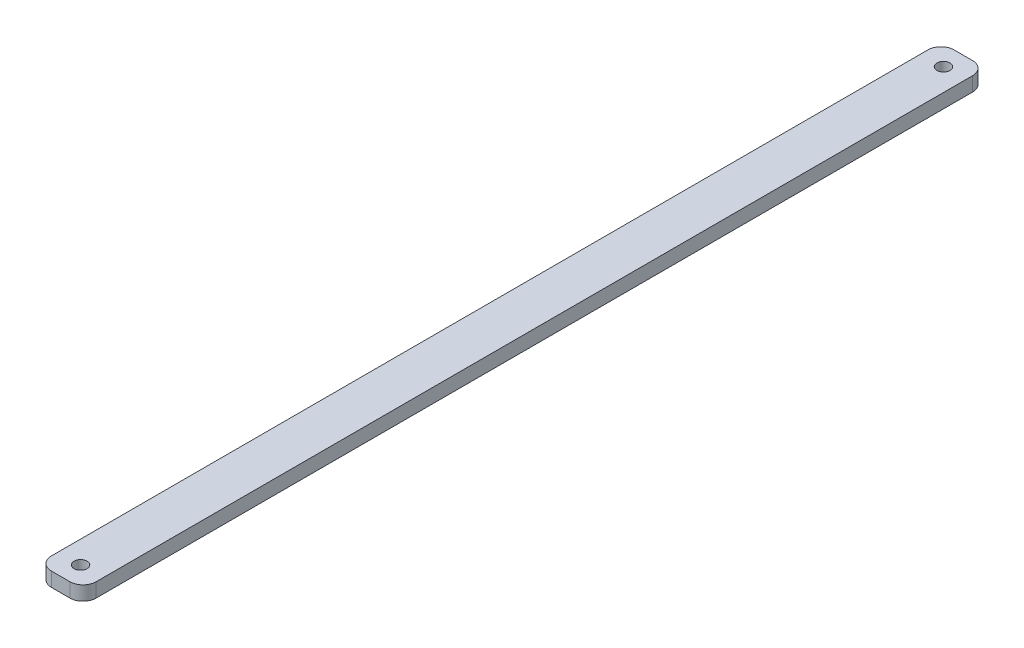
ISO-10303-21;
HEADER;
FILE_DESCRIPTION(('STEP AP214'),'2;1');
FILE_NAME('part.step','',(''),(''),'','','');
FILE_SCHEMA(('AUTOMOTIVE_DESIGN { 1 0 10303 214 1 1 1 1 }'));
ENDSEC;
DATA;
#1=APPLICATION_CONTEXT('core data for automotive mechanical design processes');
#2=APPLICATION_PROTOCOL_DEFINITION('international standard','automotive_design',2000,#1);
#3=PRODUCT_CONTEXT('',#1,'mechanical');
#4=PRODUCT('Part','Part','',(#3));
#5=PRODUCT_RELATED_PRODUCT_CATEGORY('part','',(#4));
#6=PRODUCT_DEFINITION_FORMATION('','',#4);
#7=PRODUCT_DEFINITION_CONTEXT('part definition',#1,'design');
#8=PRODUCT_DEFINITION('design','',#6,#7);
#9=PRODUCT_DEFINITION_SHAPE('','',#8);
#10=(LENGTH_UNIT() NAMED_UNIT(*) SI_UNIT(.MILLI.,.METRE.));
#11=(NAMED_UNIT(*) PLANE_ANGLE_UNIT() SI_UNIT($,.RADIAN.));
#12=(NAMED_UNIT(*) SI_UNIT($,.STERADIAN.) SOLID_ANGLE_UNIT());
#13=UNCERTAINTY_MEASURE_WITH_UNIT(LENGTH_MEASURE(1.E-05),#10,'distance_accuracy_value','');
#14=(GEOMETRIC_REPRESENTATION_CONTEXT(3) GLOBAL_UNCERTAINTY_ASSIGNED_CONTEXT((#13)) GLOBAL_UNIT_ASSIGNED_CONTEXT((#10,
#11,#12)) REPRESENTATION_CONTEXT('',''));
#15=CARTESIAN_POINT('',(0.,0.,0.));
#16=DIRECTION('',(0.,0.,1.));
#17=DIRECTION('',(1.,0.,0.));
#18=AXIS2_PLACEMENT_3D('',#15,#16,#17);
#19=CARTESIAN_POINT('',(0.,3.175,0.));
#20=DIRECTION('',(0.,1.,0.));
#21=DIRECTION('',(0.,0.,1.));
#22=AXIS2_PLACEMENT_3D('',#19,#20,#21);
#23=PLANE('',#22);
#24=CARTESIAN_POINT('',(0.,3.175,-96.52));
#25=DIRECTION('',(0.,1.,0.));
#26=DIRECTION('',(0.,0.,1.));
#27=AXIS2_PLACEMENT_3D('',#24,#25,#26);
#28=CIRCLE('',#27,1.4605);
#29=CARTESIAN_POINT('',(0.,3.175,-95.0595));
#30=VERTEX_POINT('',#29);
#31=EDGE_CURVE('E135',#30,#30,#28,.T.);
#32=ORIENTED_EDGE('',*,*,#31,.F.);
#33=EDGE_LOOP('',(#32));
#34=FACE_BOUND('',#33,.T.);
#35=DIRECTION('',(0.,0.,-1.));
#36=VECTOR('',#35,1.);
#37=CARTESIAN_POINT('',(4.99999999999999,3.175,-100.965));
#38=LINE('',#37,#36);
#39=CARTESIAN_POINT('',(5.00000000000001,3.175,98.044));
#40=VERTEX_POINT('',#39);
#41=CARTESIAN_POINT('',(4.99999999999999,3.175,-98.044));
#42=VERTEX_POINT('',#41);
#43=EDGE_CURVE('E140',#40,#42,#38,.T.);
#44=ORIENTED_EDGE('',*,*,#43,.T.);
#45=CARTESIAN_POINT('',(2.07899999999999,3.175,-98.044));
#46=DIRECTION('',(0.,1.,0.));
#47=DIRECTION('',(0.,0.,1.));
#48=AXIS2_PLACEMENT_3D('',#45,#46,#47);
#49=CIRCLE('',#48,2.921);
#50=CARTESIAN_POINT('',(2.07899999999999,3.175,-100.965));
#51=VERTEX_POINT('',#50);
#52=EDGE_CURVE('E155',#42,#51,#49,.T.);
#53=ORIENTED_EDGE('',*,*,#52,.T.);
#54=DIRECTION('',(-1.,0.,0.));
#55=VECTOR('',#54,1.);
#56=CARTESIAN_POINT('',(-5.00000000000001,3.175,-100.965));
#57=LINE('',#56,#55);
#58=CARTESIAN_POINT('',(-2.07900000000001,3.175,-100.965));
#59=VERTEX_POINT('',#58);
#60=EDGE_CURVE('E122',#51,#59,#57,.T.);
#61=ORIENTED_EDGE('',*,*,#60,.T.);
#62=CARTESIAN_POINT('',(-2.07900000000001,3.175,-98.044));
#63=DIRECTION('',(0.,1.,0.));
#64=DIRECTION('',(0.,0.,1.));
#65=AXIS2_PLACEMENT_3D('',#62,#63,#64);
#66=CIRCLE('',#65,2.921);
#67=CARTESIAN_POINT('',(-5.00000000000001,3.175,-98.044));
#68=VERTEX_POINT('',#67);
#69=EDGE_CURVE('E153',#59,#68,#66,.T.);
#70=ORIENTED_EDGE('',*,*,#69,.T.);
#71=DIRECTION('',(0.,0.,1.));
#72=VECTOR('',#71,1.);
#73=CARTESIAN_POINT('',(-5.00000000000001,3.175,-100.965));
#74=LINE('',#73,#72);
#75=CARTESIAN_POINT('',(-4.99999999999999,3.175,98.044));
#76=VERTEX_POINT('',#75);
#77=EDGE_CURVE('E175',#68,#76,#74,.T.);
#78=ORIENTED_EDGE('',*,*,#77,.T.);
#79=CARTESIAN_POINT('',(-2.07899999999999,3.175,98.044));
#80=DIRECTION('',(0.,1.,0.));
#81=DIRECTION('',(0.,0.,1.));
#82=AXIS2_PLACEMENT_3D('',#79,#80,#81);
#83=CIRCLE('',#82,2.921);
#84=CARTESIAN_POINT('',(-2.07899999999999,3.175,100.965));
#85=VERTEX_POINT('',#84);
#86=EDGE_CURVE('E57',#76,#85,#83,.T.);
#87=ORIENTED_EDGE('',*,*,#86,.T.);
#88=DIRECTION('',(1.,0.,0.));
#89=VECTOR('',#88,1.);
#90=CARTESIAN_POINT('',(-4.99999999999999,3.175,100.965));
#91=LINE('',#90,#89);
#92=CARTESIAN_POINT('',(2.07900000000001,3.175,100.965));
#93=VERTEX_POINT('',#92);
#94=EDGE_CURVE('E141',#85,#93,#91,.T.);
#95=ORIENTED_EDGE('',*,*,#94,.T.);
#96=CARTESIAN_POINT('',(2.07900000000001,3.175,98.044));
#97=DIRECTION('',(0.,1.,0.));
#98=DIRECTION('',(0.,0.,1.));
#99=AXIS2_PLACEMENT_3D('',#96,#97,#98);
#100=CIRCLE('',#99,2.921);
#101=EDGE_CURVE('E151',#93,#40,#100,.T.);
#102=ORIENTED_EDGE('',*,*,#101,.T.);
#103=EDGE_LOOP('',(#44,#53,#61,#70,#78,#87,#95,#102));
#104=FACE_BOUND('',#103,.T.);
#105=CARTESIAN_POINT('',(0.,3.175,96.52));
#106=DIRECTION('',(0.,1.,0.));
#107=DIRECTION('',(0.,0.,1.));
#108=AXIS2_PLACEMENT_3D('',#105,#106,#107);
#109=CIRCLE('',#108,1.4605);
#110=CARTESIAN_POINT('',(0.,3.175,97.9805));
#111=VERTEX_POINT('',#110);
#112=EDGE_CURVE('E187',#111,#111,#109,.T.);
#113=ORIENTED_EDGE('',*,*,#112,.F.);
#114=EDGE_LOOP('',(#113));
#115=FACE_BOUND('',#114,.T.);
#116=ADVANCED_FACE('F37',(#34,#104,#115),#23,.T.);
#117=CARTESIAN_POINT('',(0.,0.,0.));
#118=DIRECTION('',(0.,1.,0.));
#119=DIRECTION('',(0.,0.,1.));
#120=AXIS2_PLACEMENT_3D('',#117,#118,#119);
#121=PLANE('',#120);
#122=DIRECTION('',(-1.,0.,0.));
#123=VECTOR('',#122,1.);
#124=CARTESIAN_POINT('',(-5.00000000000001,0.,-100.965));
#125=LINE('',#124,#123);
#126=CARTESIAN_POINT('',(2.07899999999999,0.,-100.965));
#127=VERTEX_POINT('',#126);
#128=CARTESIAN_POINT('',(-2.07900000000001,0.,-100.965));
#129=VERTEX_POINT('',#128);
#130=EDGE_CURVE('E119',#127,#129,#125,.T.);
#131=ORIENTED_EDGE('',*,*,#130,.F.);
#132=CARTESIAN_POINT('',(2.07899999999999,0.,-98.044));
#133=DIRECTION('',(0.,1.,0.));
#134=DIRECTION('',(0.,0.,1.));
#135=AXIS2_PLACEMENT_3D('',#132,#133,#134);
#136=CIRCLE('',#135,2.921);
#137=CARTESIAN_POINT('',(4.99999999999999,0.,-98.044));
#138=VERTEX_POINT('',#137);
#139=EDGE_CURVE('E102',#127,#138,#136,.F.);
#140=ORIENTED_EDGE('',*,*,#139,.T.);
#141=DIRECTION('',(0.,0.,-1.));
#142=VECTOR('',#141,1.);
#143=CARTESIAN_POINT('',(4.99999999999999,0.,-100.965));
#144=LINE('',#143,#142);
#145=CARTESIAN_POINT('',(5.00000000000001,0.,98.044));
#146=VERTEX_POINT('',#145);
#147=EDGE_CURVE('E130',#146,#138,#144,.T.);
#148=ORIENTED_EDGE('',*,*,#147,.F.);
#149=CARTESIAN_POINT('',(2.07900000000001,0.,98.044));
#150=DIRECTION('',(0.,1.,0.));
#151=DIRECTION('',(0.,0.,1.));
#152=AXIS2_PLACEMENT_3D('',#149,#150,#151);
#153=CIRCLE('',#152,2.921);
#154=CARTESIAN_POINT('',(2.07900000000001,0.,100.965));
#155=VERTEX_POINT('',#154);
#156=EDGE_CURVE('E144',#146,#155,#153,.F.);
#157=ORIENTED_EDGE('',*,*,#156,.T.);
#158=DIRECTION('',(1.,0.,0.));
#159=VECTOR('',#158,1.);
#160=CARTESIAN_POINT('',(-4.99999999999999,0.,100.965));
#161=LINE('',#160,#159);
#162=CARTESIAN_POINT('',(-2.07899999999999,0.,100.965));
#163=VERTEX_POINT('',#162);
#164=EDGE_CURVE('E133',#163,#155,#161,.T.);
#165=ORIENTED_EDGE('',*,*,#164,.F.);
#166=CARTESIAN_POINT('',(-2.07899999999999,0.,98.044));
#167=DIRECTION('',(0.,1.,0.));
#168=DIRECTION('',(0.,0.,1.));
#169=AXIS2_PLACEMENT_3D('',#166,#167,#168);
#170=CIRCLE('',#169,2.921);
#171=CARTESIAN_POINT('',(-4.99999999999999,0.,98.044));
#172=VERTEX_POINT('',#171);
#173=EDGE_CURVE('E123',#163,#172,#170,.F.);
#174=ORIENTED_EDGE('',*,*,#173,.T.);
#175=DIRECTION('',(0.,0.,1.));
#176=VECTOR('',#175,1.);
#177=CARTESIAN_POINT('',(-5.00000000000001,0.,-100.965));
#178=LINE('',#177,#176);
#179=CARTESIAN_POINT('',(-5.00000000000001,0.,-98.044));
#180=VERTEX_POINT('',#179);
#181=EDGE_CURVE('E129',#180,#172,#178,.T.);
#182=ORIENTED_EDGE('',*,*,#181,.F.);
#183=CARTESIAN_POINT('',(-2.07900000000001,0.,-98.044));
#184=DIRECTION('',(0.,1.,0.));
#185=DIRECTION('',(0.,0.,1.));
#186=AXIS2_PLACEMENT_3D('',#183,#184,#185);
#187=CIRCLE('',#186,2.921);
#188=EDGE_CURVE('E113',#180,#129,#187,.F.);
#189=ORIENTED_EDGE('',*,*,#188,.T.);
#190=EDGE_LOOP('',(#131,#140,#148,#157,#165,#174,#182,#189));
#191=FACE_BOUND('',#190,.T.);
#192=CARTESIAN_POINT('',(0.,0.,-96.52));
#193=DIRECTION('',(0.,1.,0.));
#194=DIRECTION('',(0.,0.,1.));
#195=AXIS2_PLACEMENT_3D('',#192,#193,#194);
#196=CIRCLE('',#195,1.4605);
#197=CARTESIAN_POINT('',(0.,0.,-95.0595));
#198=VERTEX_POINT('',#197);
#199=EDGE_CURVE('E178',#198,#198,#196,.T.);
#200=ORIENTED_EDGE('',*,*,#199,.T.);
#201=EDGE_LOOP('',(#200));
#202=FACE_BOUND('',#201,.T.);
#203=CARTESIAN_POINT('',(0.,0.,96.52));
#204=DIRECTION('',(0.,1.,0.));
#205=DIRECTION('',(0.,0.,1.));
#206=AXIS2_PLACEMENT_3D('',#203,#204,#205);
#207=CIRCLE('',#206,1.4605);
#208=CARTESIAN_POINT('',(0.,0.,97.9805));
#209=VERTEX_POINT('',#208);
#210=EDGE_CURVE('E189',#209,#209,#207,.T.);
#211=ORIENTED_EDGE('',*,*,#210,.T.);
#212=EDGE_LOOP('',(#211));
#213=FACE_BOUND('',#212,.T.);
#214=ADVANCED_FACE('F126',(#191,#202,#213),#121,.F.);
#215=CARTESIAN_POINT('',(4.99999999999999,3.175,-100.965));
#216=DIRECTION('',(-1.,0.,0.));
#217=DIRECTION('',(0.,0.,1.));
#218=AXIS2_PLACEMENT_3D('',#215,#216,#217);
#219=PLANE('',#218);
#220=ORIENTED_EDGE('',*,*,#147,.T.);
#221=DIRECTION('',(0.,-1.,0.));
#222=VECTOR('',#221,1.);
#223=CARTESIAN_POINT('',(4.99999999999999,3.175,-98.044));
#224=LINE('',#223,#222);
#225=EDGE_CURVE('E107',#138,#42,#224,.F.);
#226=ORIENTED_EDGE('',*,*,#225,.T.);
#227=ORIENTED_EDGE('',*,*,#43,.F.);
#228=DIRECTION('',(0.,-1.,0.));
#229=VECTOR('',#228,1.);
#230=CARTESIAN_POINT('',(5.00000000000001,3.175,98.044));
#231=LINE('',#230,#229);
#232=EDGE_CURVE('E112',#40,#146,#231,.T.);
#233=ORIENTED_EDGE('',*,*,#232,.T.);
#234=EDGE_LOOP('',(#220,#226,#227,#233));
#235=FACE_BOUND('',#234,.T.);
#236=ADVANCED_FACE('F172',(#235),#219,.F.);
#237=CARTESIAN_POINT('',(-5.00000000000001,3.175,-100.965));
#238=DIRECTION('',(0.,0.,1.));
#239=DIRECTION('',(1.,0.,0.));
#240=AXIS2_PLACEMENT_3D('',#237,#238,#239);
#241=PLANE('',#240);
#242=ORIENTED_EDGE('',*,*,#60,.F.);
#243=DIRECTION('',(0.,-1.,0.));
#244=VECTOR('',#243,1.);
#245=CARTESIAN_POINT('',(2.07899999999999,3.175,-100.965));
#246=LINE('',#245,#244);
#247=EDGE_CURVE('E106',#51,#127,#246,.T.);
#248=ORIENTED_EDGE('',*,*,#247,.T.);
#249=ORIENTED_EDGE('',*,*,#130,.T.);
#250=DIRECTION('',(0.,-1.,0.));
#251=VECTOR('',#250,1.);
#252=CARTESIAN_POINT('',(-2.07900000000001,3.175,-100.965));
#253=LINE('',#252,#251);
#254=EDGE_CURVE('E124',#129,#59,#253,.F.);
#255=ORIENTED_EDGE('',*,*,#254,.T.);
#256=EDGE_LOOP('',(#242,#248,#249,#255));
#257=FACE_BOUND('',#256,.T.);
#258=ADVANCED_FACE('F118',(#257),#241,.F.);
#259=CARTESIAN_POINT('',(-5.00000000000001,3.175,-100.965));
#260=DIRECTION('',(1.,0.,0.));
#261=DIRECTION('',(0.,0.,-1.));
#262=AXIS2_PLACEMENT_3D('',#259,#260,#261);
#263=PLANE('',#262);
#264=ORIENTED_EDGE('',*,*,#77,.F.);
#265=DIRECTION('',(0.,-1.,0.));
#266=VECTOR('',#265,1.);
#267=CARTESIAN_POINT('',(-5.00000000000001,3.175,-98.044));
#268=LINE('',#267,#266);
#269=EDGE_CURVE('E159',#68,#180,#268,.T.);
#270=ORIENTED_EDGE('',*,*,#269,.T.);
#271=ORIENTED_EDGE('',*,*,#181,.T.);
#272=DIRECTION('',(0.,-1.,0.));
#273=VECTOR('',#272,1.);
#274=CARTESIAN_POINT('',(-4.99999999999999,3.175,98.044));
#275=LINE('',#274,#273);
#276=EDGE_CURVE('E157',#172,#76,#275,.F.);
#277=ORIENTED_EDGE('',*,*,#276,.T.);
#278=EDGE_LOOP('',(#264,#270,#271,#277));
#279=FACE_BOUND('',#278,.T.);
#280=ADVANCED_FACE('F218',(#279),#263,.F.);
#281=CARTESIAN_POINT('',(-4.99999999999999,3.175,100.965));
#282=DIRECTION('',(0.,0.,-1.));
#283=DIRECTION('',(-1.,0.,0.));
#284=AXIS2_PLACEMENT_3D('',#281,#282,#283);
#285=PLANE('',#284);
#286=ORIENTED_EDGE('',*,*,#164,.T.);
#287=DIRECTION('',(0.,-1.,0.));
#288=VECTOR('',#287,1.);
#289=CARTESIAN_POINT('',(2.07900000000001,3.175,100.965));
#290=LINE('',#289,#288);
#291=EDGE_CURVE('E11',#155,#93,#290,.F.);
#292=ORIENTED_EDGE('',*,*,#291,.T.);
#293=ORIENTED_EDGE('',*,*,#94,.F.);
#294=DIRECTION('',(0.,-1.,0.));
#295=VECTOR('',#294,1.);
#296=CARTESIAN_POINT('',(-2.07899999999999,3.175,100.965));
#297=LINE('',#296,#295);
#298=EDGE_CURVE('E45',#85,#163,#297,.T.);
#299=ORIENTED_EDGE('',*,*,#298,.T.);
#300=EDGE_LOOP('',(#286,#292,#293,#299));
#301=FACE_BOUND('',#300,.T.);
#302=ADVANCED_FACE('F164',(#301),#285,.F.);
#303=CARTESIAN_POINT('',(0.,3.175,-96.52));
#304=DIRECTION('',(0.,-1.,0.));
#305=DIRECTION('',(0.,0.,-1.));
#306=AXIS2_PLACEMENT_3D('',#303,#304,#305);
#307=CYLINDRICAL_SURFACE('',#306,1.4605);
#308=ORIENTED_EDGE('',*,*,#31,.T.);
#309=EDGE_LOOP('',(#308));
#310=FACE_BOUND('',#309,.T.);
#311=ORIENTED_EDGE('',*,*,#199,.F.);
#312=EDGE_LOOP('',(#311));
#313=FACE_BOUND('',#312,.T.);
#314=ADVANCED_FACE('F197',(#310,#313),#307,.F.);
#315=CARTESIAN_POINT('',(0.,3.175,96.52));
#316=DIRECTION('',(0.,-1.,0.));
#317=DIRECTION('',(0.,0.,-1.));
#318=AXIS2_PLACEMENT_3D('',#315,#316,#317);
#319=CYLINDRICAL_SURFACE('',#318,1.4605);
#320=ORIENTED_EDGE('',*,*,#112,.T.);
#321=EDGE_LOOP('',(#320));
#322=FACE_BOUND('',#321,.T.);
#323=ORIENTED_EDGE('',*,*,#210,.F.);
#324=EDGE_LOOP('',(#323));
#325=FACE_BOUND('',#324,.T.);
#326=ADVANCED_FACE('F200',(#322,#325),#319,.F.);
#327=CARTESIAN_POINT('',(2.07899999999999,3.175,-98.044));
#328=DIRECTION('',(0.,-1.,0.));
#329=DIRECTION('',(0.,0.,-1.));
#330=AXIS2_PLACEMENT_3D('',#327,#328,#329);
#331=CYLINDRICAL_SURFACE('',#330,2.921);
#332=ORIENTED_EDGE('',*,*,#52,.F.);
#333=ORIENTED_EDGE('',*,*,#225,.F.);
#334=ORIENTED_EDGE('',*,*,#139,.F.);
#335=ORIENTED_EDGE('',*,*,#247,.F.);
#336=EDGE_LOOP('',(#332,#333,#334,#335));
#337=FACE_BOUND('',#336,.T.);
#338=ADVANCED_FACE('F105',(#337),#331,.T.);
#339=CARTESIAN_POINT('',(-2.07900000000001,3.175,-98.044));
#340=DIRECTION('',(0.,-1.,0.));
#341=DIRECTION('',(0.,0.,-1.));
#342=AXIS2_PLACEMENT_3D('',#339,#340,#341);
#343=CYLINDRICAL_SURFACE('',#342,2.921);
#344=ORIENTED_EDGE('',*,*,#69,.F.);
#345=ORIENTED_EDGE('',*,*,#254,.F.);
#346=ORIENTED_EDGE('',*,*,#188,.F.);
#347=ORIENTED_EDGE('',*,*,#269,.F.);
#348=EDGE_LOOP('',(#344,#345,#346,#347));
#349=FACE_BOUND('',#348,.T.);
#350=ADVANCED_FACE('F213',(#349),#343,.T.);
#351=CARTESIAN_POINT('',(2.07900000000001,3.175,98.044));
#352=DIRECTION('',(0.,-1.,0.));
#353=DIRECTION('',(0.,0.,-1.));
#354=AXIS2_PLACEMENT_3D('',#351,#352,#353);
#355=CYLINDRICAL_SURFACE('',#354,2.921);
#356=ORIENTED_EDGE('',*,*,#101,.F.);
#357=ORIENTED_EDGE('',*,*,#291,.F.);
#358=ORIENTED_EDGE('',*,*,#156,.F.);
#359=ORIENTED_EDGE('',*,*,#232,.F.);
#360=EDGE_LOOP('',(#356,#357,#358,#359));
#361=FACE_BOUND('',#360,.T.);
#362=ADVANCED_FACE('F169',(#361),#355,.T.);
#363=CARTESIAN_POINT('',(-2.07899999999999,3.175,98.044));
#364=DIRECTION('',(0.,-1.,0.));
#365=DIRECTION('',(0.,0.,-1.));
#366=AXIS2_PLACEMENT_3D('',#363,#364,#365);
#367=CYLINDRICAL_SURFACE('',#366,2.921);
#368=ORIENTED_EDGE('',*,*,#86,.F.);
#369=ORIENTED_EDGE('',*,*,#276,.F.);
#370=ORIENTED_EDGE('',*,*,#173,.F.);
#371=ORIENTED_EDGE('',*,*,#298,.F.);
#372=EDGE_LOOP('',(#368,#369,#370,#371));
#373=FACE_BOUND('',#372,.T.);
#374=ADVANCED_FACE('F39',(#373),#367,.T.);
#375=CLOSED_SHELL('',(#116,#214,#236,#258,#280,#302,#314,#326,#338,#350,#362,#374));
#376=MANIFOLD_SOLID_BREP('B2',#375);
#377=ADVANCED_BREP_SHAPE_REPRESENTATION('',(#18,#376),#14);
#378=SHAPE_DEFINITION_REPRESENTATION(#9,#377);
ENDSEC;
END-ISO-10303-21;
